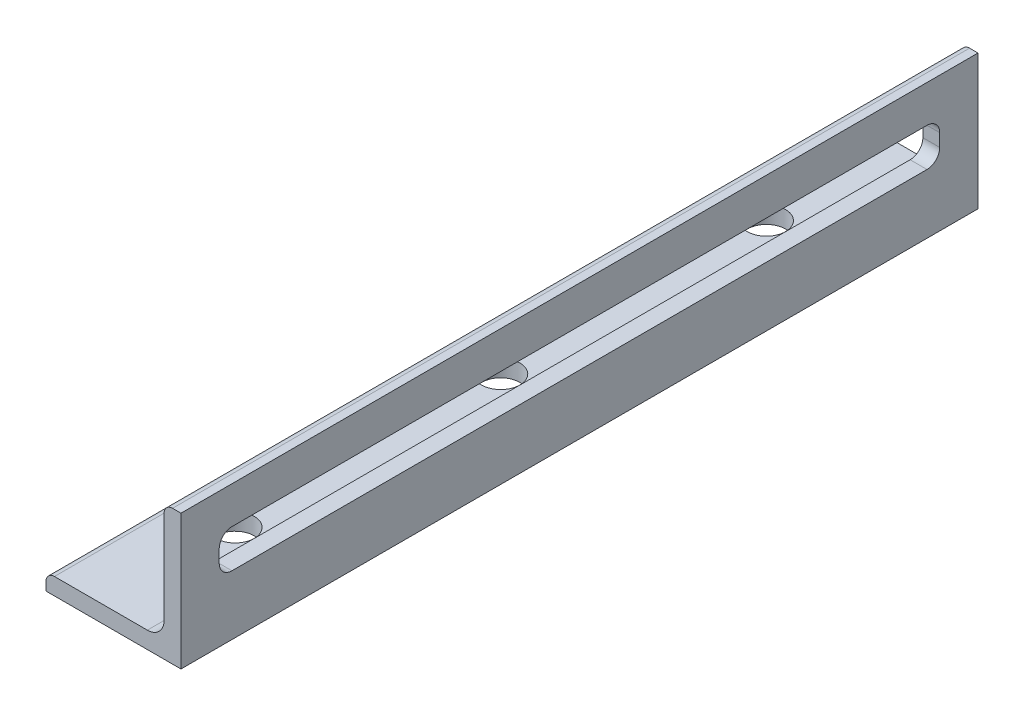
ISO-10303-21;
HEADER;
FILE_DESCRIPTION(('STEP AP214'),'2;1');
FILE_NAME('part.step','',(''),(''),'','','');
FILE_SCHEMA(('AUTOMOTIVE_DESIGN { 1 0 10303 214 1 1 1 1 }'));
ENDSEC;
DATA;
#1=APPLICATION_CONTEXT('core data for automotive mechanical design processes');
#2=APPLICATION_PROTOCOL_DEFINITION('international standard','automotive_design',2000,#1);
#3=PRODUCT_CONTEXT('',#1,'mechanical');
#4=PRODUCT('Part','Part','',(#3));
#5=PRODUCT_RELATED_PRODUCT_CATEGORY('part','',(#4));
#6=PRODUCT_DEFINITION_FORMATION('','',#4);
#7=PRODUCT_DEFINITION_CONTEXT('part definition',#1,'design');
#8=PRODUCT_DEFINITION('design','',#6,#7);
#9=PRODUCT_DEFINITION_SHAPE('','',#8);
#10=(LENGTH_UNIT() NAMED_UNIT(*) SI_UNIT(.MILLI.,.METRE.));
#11=(NAMED_UNIT(*) PLANE_ANGLE_UNIT() SI_UNIT($,.RADIAN.));
#12=(NAMED_UNIT(*) SI_UNIT($,.STERADIAN.) SOLID_ANGLE_UNIT());
#13=UNCERTAINTY_MEASURE_WITH_UNIT(LENGTH_MEASURE(1.E-05),#10,'distance_accuracy_value','');
#14=(GEOMETRIC_REPRESENTATION_CONTEXT(3) GLOBAL_UNCERTAINTY_ASSIGNED_CONTEXT((#13)) GLOBAL_UNIT_ASSIGNED_CONTEXT((#10,
#11,#12)) REPRESENTATION_CONTEXT('',''));
#15=CARTESIAN_POINT('',(0.,0.,0.));
#16=DIRECTION('',(0.,0.,1.));
#17=DIRECTION('',(1.,0.,0.));
#18=AXIS2_PLACEMENT_3D('',#15,#16,#17);
#19=CARTESIAN_POINT('',(-6.35,-5.55625000000001,37.5));
#20=DIRECTION('',(1.,0.,0.));
#21=DIRECTION('',(0.,0.,-1.));
#22=AXIS2_PLACEMENT_3D('',#19,#20,#21);
#23=PLANE('',#22);
#24=DIRECTION('',(0.,-1.,0.));
#25=VECTOR('',#24,1.);
#26=CARTESIAN_POINT('',(-6.35,-5.55625000000001,-37.5));
#27=LINE('',#26,#25);
#28=CARTESIAN_POINT('',(-6.35,-5.55625000000001,-37.5));
#29=VERTEX_POINT('',#28);
#30=CARTESIAN_POINT('',(-6.35,-6.35,-37.5));
#31=VERTEX_POINT('',#30);
#32=EDGE_CURVE('E279',#29,#31,#27,.T.);
#33=ORIENTED_EDGE('',*,*,#32,.T.);
#34=DIRECTION('',(0.,0.,-1.));
#35=VECTOR('',#34,1.);
#36=CARTESIAN_POINT('',(-6.35,-6.35,37.5));
#37=LINE('',#36,#35);
#38=CARTESIAN_POINT('',(-6.35,-6.35,37.5));
#39=VERTEX_POINT('',#38);
#40=EDGE_CURVE('E11',#39,#31,#37,.T.);
#41=ORIENTED_EDGE('',*,*,#40,.F.);
#42=DIRECTION('',(0.,-1.,0.));
#43=VECTOR('',#42,1.);
#44=CARTESIAN_POINT('',(-6.35,-5.55625000000001,37.5));
#45=LINE('',#44,#43);
#46=CARTESIAN_POINT('',(-6.35,-5.55625000000001,37.5));
#47=VERTEX_POINT('',#46);
#48=EDGE_CURVE('E283',#47,#39,#45,.T.);
#49=ORIENTED_EDGE('',*,*,#48,.F.);
#50=DIRECTION('',(0.,0.,-1.));
#51=VECTOR('',#50,1.);
#52=CARTESIAN_POINT('',(-6.35,-5.55625000000001,37.5));
#53=LINE('',#52,#51);
#54=EDGE_CURVE('E312',#47,#29,#53,.T.);
#55=ORIENTED_EDGE('',*,*,#54,.T.);
#56=EDGE_LOOP('',(#33,#41,#49,#55));
#57=FACE_BOUND('',#56,.T.);
#58=ADVANCED_FACE('F47',(#57),#23,.F.);
#59=CARTESIAN_POINT('',(-6.35,-6.35,37.5));
#60=DIRECTION('',(0.,1.,0.));
#61=DIRECTION('',(-1.,0.,0.));
#62=AXIS2_PLACEMENT_3D('',#59,#60,#61);
#63=PLANE('',#62);
#64=CARTESIAN_POINT('',(-1.06229999999997,-6.35,25.));
#65=DIRECTION('',(0.,1.,0.));
#66=DIRECTION('',(-1.,0.,0.));
#67=AXIS2_PLACEMENT_3D('',#64,#65,#66);
#68=CIRCLE('',#67,1.8);
#69=CARTESIAN_POINT('',(-2.86229999999997,-6.35,25.));
#70=VERTEX_POINT('',#69);
#71=EDGE_CURVE('E241',#70,#70,#68,.T.);
#72=ORIENTED_EDGE('',*,*,#71,.T.);
#73=EDGE_LOOP('',(#72));
#74=FACE_BOUND('',#73,.T.);
#75=CARTESIAN_POINT('',(-1.06229999999998,-6.35,-25.));
#76=DIRECTION('',(0.,1.,0.));
#77=DIRECTION('',(-1.,0.,0.));
#78=AXIS2_PLACEMENT_3D('',#75,#76,#77);
#79=CIRCLE('',#78,1.8);
#80=CARTESIAN_POINT('',(-2.86229999999998,-6.35,-25.));
#81=VERTEX_POINT('',#80);
#82=EDGE_CURVE('E264',#81,#81,#79,.T.);
#83=ORIENTED_EDGE('',*,*,#82,.T.);
#84=EDGE_LOOP('',(#83));
#85=FACE_BOUND('',#84,.T.);
#86=CARTESIAN_POINT('',(-1.06229999999997,-6.35,0.));
#87=DIRECTION('',(0.,1.,0.));
#88=DIRECTION('',(-1.,0.,0.));
#89=AXIS2_PLACEMENT_3D('',#86,#87,#88);
#90=CIRCLE('',#89,1.8);
#91=CARTESIAN_POINT('',(-2.86229999999997,-6.35,0.));
#92=VERTEX_POINT('',#91);
#93=EDGE_CURVE('E275',#92,#92,#90,.T.);
#94=ORIENTED_EDGE('',*,*,#93,.T.);
#95=EDGE_LOOP('',(#94));
#96=FACE_BOUND('',#95,.T.);
#97=DIRECTION('',(1.,0.,0.));
#98=VECTOR('',#97,1.);
#99=CARTESIAN_POINT('',(-6.35,-6.35,-37.5));
#100=LINE('',#99,#98);
#101=CARTESIAN_POINT('',(6.35,-6.35,-37.5));
#102=VERTEX_POINT('',#101);
#103=EDGE_CURVE('E316',#31,#102,#100,.T.);
#104=ORIENTED_EDGE('',*,*,#103,.T.);
#105=DIRECTION('',(0.,0.,-1.));
#106=VECTOR('',#105,1.);
#107=CARTESIAN_POINT('',(6.35,-6.35,37.5));
#108=LINE('',#107,#106);
#109=CARTESIAN_POINT('',(6.35,-6.35,37.5));
#110=VERTEX_POINT('',#109);
#111=EDGE_CURVE('E55',#110,#102,#108,.T.);
#112=ORIENTED_EDGE('',*,*,#111,.F.);
#113=DIRECTION('',(1.,0.,0.));
#114=VECTOR('',#113,1.);
#115=CARTESIAN_POINT('',(-6.35,-6.35,37.5));
#116=LINE('',#115,#114);
#117=EDGE_CURVE('E287',#39,#110,#116,.T.);
#118=ORIENTED_EDGE('',*,*,#117,.F.);
#119=ORIENTED_EDGE('',*,*,#40,.T.);
#120=EDGE_LOOP('',(#104,#112,#118,#119));
#121=FACE_BOUND('',#120,.T.);
#122=ADVANCED_FACE('F392',(#74,#85,#96,#121),#63,.F.);
#123=CARTESIAN_POINT('',(6.35,-6.35,37.5));
#124=DIRECTION('',(-1.,0.,0.));
#125=DIRECTION('',(0.,-1.,0.));
#126=AXIS2_PLACEMENT_3D('',#123,#124,#125);
#127=PLANE('',#126);
#128=DIRECTION('',(0.,0.,1.));
#129=VECTOR('',#128,1.);
#130=CARTESIAN_POINT('',(6.35,-0.743749999999987,-32.7));
#131=LINE('',#130,#129);
#132=CARTESIAN_POINT('',(6.35,-0.743749999999987,-32.7));
#133=VERTEX_POINT('',#132);
#134=CARTESIAN_POINT('',(6.35,-0.743749999999987,32.7));
#135=VERTEX_POINT('',#134);
#136=EDGE_CURVE('E175',#133,#135,#131,.T.);
#137=ORIENTED_EDGE('',*,*,#136,.T.);
#138=CARTESIAN_POINT('',(6.35,0.456250000000013,32.7));
#139=DIRECTION('',(-1.,0.,0.));
#140=DIRECTION('',(0.,1.,0.));
#141=AXIS2_PLACEMENT_3D('',#138,#139,#140);
#142=CIRCLE('',#141,1.19999999999999);
#143=CARTESIAN_POINT('',(6.35,0.456250000000013,33.9));
#144=VERTEX_POINT('',#143);
#145=EDGE_CURVE('E168',#135,#144,#142,.T.);
#146=ORIENTED_EDGE('',*,*,#145,.T.);
#147=DIRECTION('',(0.,1.,0.));
#148=VECTOR('',#147,1.);
#149=CARTESIAN_POINT('',(6.35,1.65625000000001,33.9));
#150=LINE('',#149,#148);
#151=CARTESIAN_POINT('',(6.35,1.65625000000001,33.9));
#152=VERTEX_POINT('',#151);
#153=EDGE_CURVE('E178',#144,#152,#150,.T.);
#154=ORIENTED_EDGE('',*,*,#153,.T.);
#155=CARTESIAN_POINT('',(6.35,1.65625000000001,32.7));
#156=DIRECTION('',(-1.,0.,0.));
#157=DIRECTION('',(0.,1.,0.));
#158=AXIS2_PLACEMENT_3D('',#155,#156,#157);
#159=CIRCLE('',#158,1.2);
#160=CARTESIAN_POINT('',(6.35,2.85625000000001,32.7));
#161=VERTEX_POINT('',#160);
#162=EDGE_CURVE('E62',#152,#161,#159,.T.);
#163=ORIENTED_EDGE('',*,*,#162,.T.);
#164=DIRECTION('',(0.,0.,-1.));
#165=VECTOR('',#164,1.);
#166=CARTESIAN_POINT('',(6.35,2.85625000000001,-32.7));
#167=LINE('',#166,#165);
#168=CARTESIAN_POINT('',(6.35,2.85625000000001,-32.7));
#169=VERTEX_POINT('',#168);
#170=EDGE_CURVE('E197',#161,#169,#167,.T.);
#171=ORIENTED_EDGE('',*,*,#170,.T.);
#172=CARTESIAN_POINT('',(6.35,1.65625000000001,-32.7));
#173=DIRECTION('',(-1.,0.,0.));
#174=DIRECTION('',(0.,-1.,0.));
#175=AXIS2_PLACEMENT_3D('',#172,#173,#174);
#176=CIRCLE('',#175,1.2);
#177=CARTESIAN_POINT('',(6.35,1.65625000000001,-33.9));
#178=VERTEX_POINT('',#177);
#179=EDGE_CURVE('E201',#169,#178,#176,.T.);
#180=ORIENTED_EDGE('',*,*,#179,.T.);
#181=DIRECTION('',(0.,-1.,0.));
#182=VECTOR('',#181,1.);
#183=CARTESIAN_POINT('',(6.35,1.65625000000001,-33.9));
#184=LINE('',#183,#182);
#185=CARTESIAN_POINT('',(6.35,0.456250000000013,-33.9));
#186=VERTEX_POINT('',#185);
#187=EDGE_CURVE('E205',#178,#186,#184,.T.);
#188=ORIENTED_EDGE('',*,*,#187,.T.);
#189=CARTESIAN_POINT('',(6.35,0.456250000000013,-32.7));
#190=DIRECTION('',(-1.,0.,0.));
#191=DIRECTION('',(0.,1.,0.));
#192=AXIS2_PLACEMENT_3D('',#189,#190,#191);
#193=CIRCLE('',#192,1.2);
#194=EDGE_CURVE('E209',#186,#133,#193,.T.);
#195=ORIENTED_EDGE('',*,*,#194,.T.);
#196=EDGE_LOOP('',(#137,#146,#154,#163,#171,#180,#188,#195));
#197=FACE_BOUND('',#196,.T.);
#198=DIRECTION('',(0.,1.,0.));
#199=VECTOR('',#198,1.);
#200=CARTESIAN_POINT('',(6.35,-6.35,-37.5));
#201=LINE('',#200,#199);
#202=CARTESIAN_POINT('',(6.35,6.35,-37.5));
#203=VERTEX_POINT('',#202);
#204=EDGE_CURVE('E319',#102,#203,#201,.T.);
#205=ORIENTED_EDGE('',*,*,#204,.T.);
#206=DIRECTION('',(0.,0.,-1.));
#207=VECTOR('',#206,1.);
#208=CARTESIAN_POINT('',(6.35,6.35,37.5));
#209=LINE('',#208,#207);
#210=CARTESIAN_POINT('',(6.35,6.35,37.5));
#211=VERTEX_POINT('',#210);
#212=EDGE_CURVE('E362',#211,#203,#209,.T.);
#213=ORIENTED_EDGE('',*,*,#212,.F.);
#214=DIRECTION('',(0.,1.,0.));
#215=VECTOR('',#214,1.);
#216=CARTESIAN_POINT('',(6.35,-6.35,37.5));
#217=LINE('',#216,#215);
#218=EDGE_CURVE('E291',#110,#211,#217,.T.);
#219=ORIENTED_EDGE('',*,*,#218,.F.);
#220=ORIENTED_EDGE('',*,*,#111,.T.);
#221=EDGE_LOOP('',(#205,#213,#219,#220));
#222=FACE_BOUND('',#221,.T.);
#223=ADVANCED_FACE('F183',(#197,#222),#127,.F.);
#224=CARTESIAN_POINT('',(5.55625000000001,6.35,37.5));
#225=DIRECTION('',(0.,-1.,0.));
#226=DIRECTION('',(1.,0.,0.));
#227=AXIS2_PLACEMENT_3D('',#224,#225,#226);
#228=PLANE('',#227);
#229=DIRECTION('',(-1.,0.,0.));
#230=VECTOR('',#229,1.);
#231=CARTESIAN_POINT('',(5.55625000000001,6.35,-37.5));
#232=LINE('',#231,#230);
#233=CARTESIAN_POINT('',(5.55625000000001,6.35,-37.5));
#234=VERTEX_POINT('',#233);
#235=EDGE_CURVE('E322',#203,#234,#232,.T.);
#236=ORIENTED_EDGE('',*,*,#235,.T.);
#237=DIRECTION('',(0.,0.,-1.));
#238=VECTOR('',#237,1.);
#239=CARTESIAN_POINT('',(5.55625000000001,6.35,37.5));
#240=LINE('',#239,#238);
#241=CARTESIAN_POINT('',(5.55625000000001,6.35,37.5));
#242=VERTEX_POINT('',#241);
#243=EDGE_CURVE('E358',#242,#234,#240,.T.);
#244=ORIENTED_EDGE('',*,*,#243,.F.);
#245=DIRECTION('',(-1.,0.,0.));
#246=VECTOR('',#245,1.);
#247=CARTESIAN_POINT('',(5.55625000000001,6.35,37.5));
#248=LINE('',#247,#246);
#249=EDGE_CURVE('E294',#211,#242,#248,.T.);
#250=ORIENTED_EDGE('',*,*,#249,.F.);
#251=ORIENTED_EDGE('',*,*,#212,.T.);
#252=EDGE_LOOP('',(#236,#244,#250,#251));
#253=FACE_BOUND('',#252,.T.);
#254=ADVANCED_FACE('F380',(#253),#228,.F.);
#255=CARTESIAN_POINT('',(5.55625000000001,5.55625000000001,37.5));
#256=DIRECTION('',(0.,0.,-1.));
#257=DIRECTION('',(-1.,0.,0.));
#258=AXIS2_PLACEMENT_3D('',#255,#256,#257);
#259=CYLINDRICAL_SURFACE('',#258,0.793749999999986);
#260=CARTESIAN_POINT('',(5.55625000000001,5.55625000000001,-37.5));
#261=DIRECTION('',(0.,0.,1.));
#262=DIRECTION('',(-1.,0.,0.));
#263=AXIS2_PLACEMENT_3D('',#260,#261,#262);
#264=CIRCLE('',#263,0.793749999999986);
#265=CARTESIAN_POINT('',(4.76250000000003,5.55625000000001,-37.5));
#266=VERTEX_POINT('',#265);
#267=EDGE_CURVE('E325',#234,#266,#264,.T.);
#268=ORIENTED_EDGE('',*,*,#267,.T.);
#269=DIRECTION('',(0.,0.,-1.));
#270=VECTOR('',#269,1.);
#271=CARTESIAN_POINT('',(4.76250000000003,5.55625000000001,37.5));
#272=LINE('',#271,#270);
#273=CARTESIAN_POINT('',(4.76250000000003,5.55625000000001,37.5));
#274=VERTEX_POINT('',#273);
#275=EDGE_CURVE('E354',#274,#266,#272,.T.);
#276=ORIENTED_EDGE('',*,*,#275,.F.);
#277=CARTESIAN_POINT('',(5.55625000000001,5.55625000000001,37.5));
#278=DIRECTION('',(0.,0.,1.));
#279=DIRECTION('',(-1.,0.,0.));
#280=AXIS2_PLACEMENT_3D('',#277,#278,#279);
#281=CIRCLE('',#280,0.793749999999986);
#282=EDGE_CURVE('E297',#242,#274,#281,.T.);
#283=ORIENTED_EDGE('',*,*,#282,.F.);
#284=ORIENTED_EDGE('',*,*,#243,.T.);
#285=EDGE_LOOP('',(#268,#276,#283,#284));
#286=FACE_BOUND('',#285,.T.);
#287=ADVANCED_FACE('F384',(#286),#259,.T.);
#288=CARTESIAN_POINT('',(4.76250000000003,5.55625000000001,37.5));
#289=DIRECTION('',(1.,0.,0.));
#290=DIRECTION('',(0.,1.,0.));
#291=AXIS2_PLACEMENT_3D('',#288,#289,#290);
#292=PLANE('',#291);
#293=DIRECTION('',(0.,1.,0.));
#294=VECTOR('',#293,1.);
#295=CARTESIAN_POINT('',(4.76250000000003,1.65625000000001,33.9));
#296=LINE('',#295,#294);
#297=CARTESIAN_POINT('',(4.76250000000003,0.456250000000012,33.9));
#298=VERTEX_POINT('',#297);
#299=CARTESIAN_POINT('',(4.76250000000003,1.65625000000001,33.9));
#300=VERTEX_POINT('',#299);
#301=EDGE_CURVE('E216',#298,#300,#296,.T.);
#302=ORIENTED_EDGE('',*,*,#301,.F.);
#303=CARTESIAN_POINT('',(4.76250000000003,0.456250000000013,32.7));
#304=DIRECTION('',(-1.,0.,0.));
#305=DIRECTION('',(0.,1.,0.));
#306=AXIS2_PLACEMENT_3D('',#303,#304,#305);
#307=CIRCLE('',#306,1.19999999999999);
#308=CARTESIAN_POINT('',(4.76250000000003,-0.743749999999987,32.7));
#309=VERTEX_POINT('',#308);
#310=EDGE_CURVE('E70',#309,#298,#307,.T.);
#311=ORIENTED_EDGE('',*,*,#310,.F.);
#312=DIRECTION('',(0.,0.,1.));
#313=VECTOR('',#312,1.);
#314=CARTESIAN_POINT('',(4.76250000000003,-0.743749999999987,-32.7));
#315=LINE('',#314,#313);
#316=CARTESIAN_POINT('',(4.76250000000003,-0.743749999999987,-32.7));
#317=VERTEX_POINT('',#316);
#318=EDGE_CURVE('E188',#317,#309,#315,.T.);
#319=ORIENTED_EDGE('',*,*,#318,.F.);
#320=CARTESIAN_POINT('',(4.76250000000003,0.456250000000013,-32.7));
#321=DIRECTION('',(-1.,0.,0.));
#322=DIRECTION('',(0.,1.,0.));
#323=AXIS2_PLACEMENT_3D('',#320,#321,#322);
#324=CIRCLE('',#323,1.2);
#325=CARTESIAN_POINT('',(4.76250000000003,0.456250000000013,-33.9));
#326=VERTEX_POINT('',#325);
#327=EDGE_CURVE('E192',#326,#317,#324,.T.);
#328=ORIENTED_EDGE('',*,*,#327,.F.);
#329=DIRECTION('',(0.,-1.,0.));
#330=VECTOR('',#329,1.);
#331=CARTESIAN_POINT('',(4.76250000000003,1.65625000000001,-33.9));
#332=LINE('',#331,#330);
#333=CARTESIAN_POINT('',(4.76250000000003,1.65625000000001,-33.9));
#334=VERTEX_POINT('',#333);
#335=EDGE_CURVE('E231',#334,#326,#332,.T.);
#336=ORIENTED_EDGE('',*,*,#335,.F.);
#337=CARTESIAN_POINT('',(4.76250000000003,1.65625000000001,-32.7));
#338=DIRECTION('',(-1.,0.,0.));
#339=DIRECTION('',(0.,-1.,0.));
#340=AXIS2_PLACEMENT_3D('',#337,#338,#339);
#341=CIRCLE('',#340,1.2);
#342=CARTESIAN_POINT('',(4.76250000000003,2.85625000000001,-32.7));
#343=VERTEX_POINT('',#342);
#344=EDGE_CURVE('E227',#343,#334,#341,.T.);
#345=ORIENTED_EDGE('',*,*,#344,.F.);
#346=DIRECTION('',(0.,0.,-1.));
#347=VECTOR('',#346,1.);
#348=CARTESIAN_POINT('',(4.76250000000003,2.85625000000001,-32.7));
#349=LINE('',#348,#347);
#350=CARTESIAN_POINT('',(4.76250000000003,2.85625000000001,32.7));
#351=VERTEX_POINT('',#350);
#352=EDGE_CURVE('E223',#351,#343,#349,.T.);
#353=ORIENTED_EDGE('',*,*,#352,.F.);
#354=CARTESIAN_POINT('',(4.76250000000003,1.65625000000001,32.7));
#355=DIRECTION('',(-1.,0.,0.));
#356=DIRECTION('',(0.,1.,0.));
#357=AXIS2_PLACEMENT_3D('',#354,#355,#356);
#358=CIRCLE('',#357,1.2);
#359=EDGE_CURVE('E219',#300,#351,#358,.T.);
#360=ORIENTED_EDGE('',*,*,#359,.F.);
#361=EDGE_LOOP('',(#302,#311,#319,#328,#336,#345,#353,#360));
#362=FACE_BOUND('',#361,.T.);
#363=DIRECTION('',(0.,-1.,0.));
#364=VECTOR('',#363,1.);
#365=CARTESIAN_POINT('',(4.76250000000003,5.55625000000001,-37.5));
#366=LINE('',#365,#364);
#367=CARTESIAN_POINT('',(4.76250000000003,-3.18770000000002,-37.5));
#368=VERTEX_POINT('',#367);
#369=EDGE_CURVE('E328',#266,#368,#366,.T.);
#370=ORIENTED_EDGE('',*,*,#369,.T.);
#371=DIRECTION('',(0.,0.,-1.));
#372=VECTOR('',#371,1.);
#373=CARTESIAN_POINT('',(4.76250000000003,-3.18770000000002,37.5));
#374=LINE('',#373,#372);
#375=CARTESIAN_POINT('',(4.76250000000003,-3.18770000000002,37.5));
#376=VERTEX_POINT('',#375);
#377=EDGE_CURVE('E350',#376,#368,#374,.T.);
#378=ORIENTED_EDGE('',*,*,#377,.F.);
#379=DIRECTION('',(0.,-1.,0.));
#380=VECTOR('',#379,1.);
#381=CARTESIAN_POINT('',(4.76250000000003,5.55625000000001,37.5));
#382=LINE('',#381,#380);
#383=EDGE_CURVE('E300',#274,#376,#382,.T.);
#384=ORIENTED_EDGE('',*,*,#383,.F.);
#385=ORIENTED_EDGE('',*,*,#275,.T.);
#386=EDGE_LOOP('',(#370,#378,#384,#385));
#387=FACE_BOUND('',#386,.T.);
#388=ADVANCED_FACE('F410',(#362,#387),#292,.F.);
#389=CARTESIAN_POINT('',(3.18770000000003,-3.18770000000002,37.5));
#390=DIRECTION('',(0.,0.,-1.));
#391=DIRECTION('',(-1.,0.,0.));
#392=AXIS2_PLACEMENT_3D('',#389,#390,#391);
#393=CYLINDRICAL_SURFACE('',#392,1.5748);
#394=CARTESIAN_POINT('',(3.18770000000003,-3.18770000000002,-37.5));
#395=DIRECTION('',(0.,0.,-1.));
#396=DIRECTION('',(-1.,0.,0.));
#397=AXIS2_PLACEMENT_3D('',#394,#395,#396);
#398=CIRCLE('',#397,1.5748);
#399=CARTESIAN_POINT('',(3.18770000000003,-4.76250000000002,-37.5));
#400=VERTEX_POINT('',#399);
#401=EDGE_CURVE('E331',#368,#400,#398,.T.);
#402=ORIENTED_EDGE('',*,*,#401,.T.);
#403=DIRECTION('',(0.,0.,-1.));
#404=VECTOR('',#403,1.);
#405=CARTESIAN_POINT('',(3.18770000000003,-4.76250000000002,37.5));
#406=LINE('',#405,#404);
#407=CARTESIAN_POINT('',(3.18770000000003,-4.76250000000002,37.5));
#408=VERTEX_POINT('',#407);
#409=EDGE_CURVE('E346',#408,#400,#406,.T.);
#410=ORIENTED_EDGE('',*,*,#409,.F.);
#411=CARTESIAN_POINT('',(3.18770000000003,-3.18770000000002,37.5));
#412=DIRECTION('',(0.,0.,-1.));
#413=DIRECTION('',(-1.,0.,0.));
#414=AXIS2_PLACEMENT_3D('',#411,#412,#413);
#415=CIRCLE('',#414,1.5748);
#416=EDGE_CURVE('E303',#376,#408,#415,.T.);
#417=ORIENTED_EDGE('',*,*,#416,.F.);
#418=ORIENTED_EDGE('',*,*,#377,.T.);
#419=EDGE_LOOP('',(#402,#410,#417,#418));
#420=FACE_BOUND('',#419,.T.);
#421=ADVANCED_FACE('F408',(#420),#393,.F.);
#422=CARTESIAN_POINT('',(3.18770000000003,-4.76250000000002,37.5));
#423=DIRECTION('',(0.,-1.,0.));
#424=DIRECTION('',(1.,0.,0.));
#425=AXIS2_PLACEMENT_3D('',#422,#423,#424);
#426=PLANE('',#425);
#427=CARTESIAN_POINT('',(-1.06229999999997,-4.76250000000002,25.));
#428=DIRECTION('',(0.,1.,0.));
#429=DIRECTION('',(-1.,0.,0.));
#430=AXIS2_PLACEMENT_3D('',#427,#428,#429);
#431=CIRCLE('',#430,1.8);
#432=CARTESIAN_POINT('',(-2.86229999999997,-4.76250000000002,25.));
#433=VERTEX_POINT('',#432);
#434=EDGE_CURVE('E268',#433,#433,#431,.T.);
#435=ORIENTED_EDGE('',*,*,#434,.F.);
#436=EDGE_LOOP('',(#435));
#437=FACE_BOUND('',#436,.T.);
#438=CARTESIAN_POINT('',(-1.06229999999998,-4.76250000000002,-25.));
#439=DIRECTION('',(0.,1.,0.));
#440=DIRECTION('',(-1.,0.,0.));
#441=AXIS2_PLACEMENT_3D('',#438,#439,#440);
#442=CIRCLE('',#441,1.8);
#443=CARTESIAN_POINT('',(-2.86229999999998,-4.76250000000002,-25.));
#444=VERTEX_POINT('',#443);
#445=EDGE_CURVE('E259',#444,#444,#442,.T.);
#446=ORIENTED_EDGE('',*,*,#445,.F.);
#447=EDGE_LOOP('',(#446));
#448=FACE_BOUND('',#447,.T.);
#449=CARTESIAN_POINT('',(-1.06229999999997,-4.76250000000002,0.));
#450=DIRECTION('',(0.,1.,0.));
#451=DIRECTION('',(-1.,0.,0.));
#452=AXIS2_PLACEMENT_3D('',#449,#450,#451);
#453=CIRCLE('',#452,1.8);
#454=CARTESIAN_POINT('',(-2.86229999999997,-4.76250000000002,0.));
#455=VERTEX_POINT('',#454);
#456=EDGE_CURVE('E263',#455,#455,#453,.T.);
#457=ORIENTED_EDGE('',*,*,#456,.F.);
#458=EDGE_LOOP('',(#457));
#459=FACE_BOUND('',#458,.T.);
#460=DIRECTION('',(-1.,0.,0.));
#461=VECTOR('',#460,1.);
#462=CARTESIAN_POINT('',(3.18770000000003,-4.76250000000002,-37.5));
#463=LINE('',#462,#461);
#464=CARTESIAN_POINT('',(-5.55625000000001,-4.76250000000003,-37.5));
#465=VERTEX_POINT('',#464);
#466=EDGE_CURVE('E334',#400,#465,#463,.T.);
#467=ORIENTED_EDGE('',*,*,#466,.T.);
#468=DIRECTION('',(0.,0.,-1.));
#469=VECTOR('',#468,1.);
#470=CARTESIAN_POINT('',(-5.55625000000001,-4.76250000000003,37.5));
#471=LINE('',#470,#469);
#472=CARTESIAN_POINT('',(-5.55625000000001,-4.76250000000003,37.5));
#473=VERTEX_POINT('',#472);
#474=EDGE_CURVE('E342',#473,#465,#471,.T.);
#475=ORIENTED_EDGE('',*,*,#474,.F.);
#476=DIRECTION('',(-1.,0.,0.));
#477=VECTOR('',#476,1.);
#478=CARTESIAN_POINT('',(3.18770000000003,-4.76250000000002,37.5));
#479=LINE('',#478,#477);
#480=EDGE_CURVE('E306',#408,#473,#479,.T.);
#481=ORIENTED_EDGE('',*,*,#480,.F.);
#482=ORIENTED_EDGE('',*,*,#409,.T.);
#483=EDGE_LOOP('',(#467,#475,#481,#482));
#484=FACE_BOUND('',#483,.T.);
#485=ADVANCED_FACE('F404',(#437,#448,#459,#484),#426,.F.);
#486=CARTESIAN_POINT('',(-5.55625000000001,-5.55625000000001,37.5));
#487=DIRECTION('',(0.,0.,-1.));
#488=DIRECTION('',(-1.,0.,0.));
#489=AXIS2_PLACEMENT_3D('',#486,#487,#488);
#490=CYLINDRICAL_SURFACE('',#489,0.793749999999987);
#491=CARTESIAN_POINT('',(-5.55625000000001,-5.55625000000001,-37.5));
#492=DIRECTION('',(0.,0.,1.));
#493=DIRECTION('',(-1.,0.,0.));
#494=AXIS2_PLACEMENT_3D('',#491,#492,#493);
#495=CIRCLE('',#494,0.793749999999987);
#496=EDGE_CURVE('E288',#465,#29,#495,.T.);
#497=ORIENTED_EDGE('',*,*,#496,.T.);
#498=ORIENTED_EDGE('',*,*,#54,.F.);
#499=CARTESIAN_POINT('',(-5.55625000000001,-5.55625000000001,37.5));
#500=DIRECTION('',(0.,0.,1.));
#501=DIRECTION('',(-1.,0.,0.));
#502=AXIS2_PLACEMENT_3D('',#499,#500,#501);
#503=CIRCLE('',#502,0.793749999999987);
#504=EDGE_CURVE('E309',#473,#47,#503,.T.);
#505=ORIENTED_EDGE('',*,*,#504,.F.);
#506=ORIENTED_EDGE('',*,*,#474,.T.);
#507=EDGE_LOOP('',(#497,#498,#505,#506));
#508=FACE_BOUND('',#507,.T.);
#509=ADVANCED_FACE('F399',(#508),#490,.T.);
#510=CARTESIAN_POINT('',(5.55625000000001,5.55625000000001,37.5));
#511=DIRECTION('',(0.,0.,-1.));
#512=DIRECTION('',(-1.,0.,0.));
#513=AXIS2_PLACEMENT_3D('',#510,#511,#512);
#514=PLANE('',#513);
#515=ORIENTED_EDGE('',*,*,#48,.T.);
#516=ORIENTED_EDGE('',*,*,#117,.T.);
#517=ORIENTED_EDGE('',*,*,#218,.T.);
#518=ORIENTED_EDGE('',*,*,#249,.T.);
#519=ORIENTED_EDGE('',*,*,#282,.T.);
#520=ORIENTED_EDGE('',*,*,#383,.T.);
#521=ORIENTED_EDGE('',*,*,#416,.T.);
#522=ORIENTED_EDGE('',*,*,#480,.T.);
#523=ORIENTED_EDGE('',*,*,#504,.T.);
#524=EDGE_LOOP('',(#515,#516,#517,#518,#519,#520,#521,#522,#523));
#525=FACE_BOUND('',#524,.T.);
#526=ADVANCED_FACE('F388',(#525),#514,.F.);
#527=CARTESIAN_POINT('',(5.55625000000001,5.55625000000001,-37.5));
#528=DIRECTION('',(0.,0.,-1.));
#529=DIRECTION('',(-1.,0.,0.));
#530=AXIS2_PLACEMENT_3D('',#527,#528,#529);
#531=PLANE('',#530);
#532=ORIENTED_EDGE('',*,*,#32,.F.);
#533=ORIENTED_EDGE('',*,*,#496,.F.);
#534=ORIENTED_EDGE('',*,*,#466,.F.);
#535=ORIENTED_EDGE('',*,*,#401,.F.);
#536=ORIENTED_EDGE('',*,*,#369,.F.);
#537=ORIENTED_EDGE('',*,*,#267,.F.);
#538=ORIENTED_EDGE('',*,*,#235,.F.);
#539=ORIENTED_EDGE('',*,*,#204,.F.);
#540=ORIENTED_EDGE('',*,*,#103,.F.);
#541=EDGE_LOOP('',(#532,#533,#534,#535,#536,#537,#538,#539,#540));
#542=FACE_BOUND('',#541,.T.);
#543=ADVANCED_FACE('F375',(#542),#531,.T.);
#544=CARTESIAN_POINT('',(-1.06229999999997,-6.35,0.));
#545=DIRECTION('',(0.,1.,0.));
#546=DIRECTION('',(-1.,0.,0.));
#547=AXIS2_PLACEMENT_3D('',#544,#545,#546);
#548=CYLINDRICAL_SURFACE('',#547,1.8);
#549=CARTESIAN_POINT('',(-2.86229999999997,-6.35,0.));
#550=CARTESIAN_POINT('',(-2.86229999999997,-6.33346354166667,0.));
#551=CARTESIAN_POINT('',(-2.86229999999997,-6.31692708333333,0.));
#552=CARTESIAN_POINT('',(-2.86229999999997,-6.28385416666667,0.));
#553=CARTESIAN_POINT('',(-2.86229999999997,-6.26731770833334,0.));
#554=CARTESIAN_POINT('',(-2.86229999999997,-6.23424479166667,0.));
#555=CARTESIAN_POINT('',(-2.86229999999997,-6.21770833333334,0.));
#556=CARTESIAN_POINT('',(-2.86229999999997,-6.18463541666667,0.));
#557=CARTESIAN_POINT('',(-2.86229999999997,-6.16809895833334,0.));
#558=CARTESIAN_POINT('',(-2.86229999999997,-6.13502604166667,0.));
#559=CARTESIAN_POINT('',(-2.86229999999997,-6.11848958333334,0.));
#560=CARTESIAN_POINT('',(-2.86229999999997,-6.08541666666667,0.));
#561=CARTESIAN_POINT('',(-2.86229999999997,-6.06888020833334,0.));
#562=CARTESIAN_POINT('',(-2.86229999999997,-6.03580729166667,0.));
#563=CARTESIAN_POINT('',(-2.86229999999997,-6.01927083333334,0.));
#564=CARTESIAN_POINT('',(-2.86229999999997,-5.98619791666667,0.));
#565=CARTESIAN_POINT('',(-2.86229999999997,-5.96966145833334,0.));
#566=CARTESIAN_POINT('',(-2.86229999999997,-5.93658854166667,0.));
#567=CARTESIAN_POINT('',(-2.86229999999997,-5.92005208333334,0.));
#568=CARTESIAN_POINT('',(-2.86229999999997,-5.88697916666668,0.));
#569=CARTESIAN_POINT('',(-2.86229999999997,-5.87044270833334,0.));
#570=CARTESIAN_POINT('',(-2.86229999999997,-5.83736979166668,0.));
#571=CARTESIAN_POINT('',(-2.86229999999997,-5.82083333333334,0.));
#572=CARTESIAN_POINT('',(-2.86229999999997,-5.78776041666668,0.));
#573=CARTESIAN_POINT('',(-2.86229999999997,-5.77122395833334,0.));
#574=CARTESIAN_POINT('',(-2.86229999999997,-5.73815104166668,0.));
#575=CARTESIAN_POINT('',(-2.86229999999997,-5.72161458333334,0.));
#576=CARTESIAN_POINT('',(-2.86229999999997,-5.68854166666668,0.));
#577=CARTESIAN_POINT('',(-2.86229999999997,-5.67200520833334,0.));
#578=CARTESIAN_POINT('',(-2.86229999999997,-5.63893229166668,0.));
#579=CARTESIAN_POINT('',(-2.86229999999997,-5.62239583333335,0.));
#580=CARTESIAN_POINT('',(-2.86229999999997,-5.58932291666668,0.));
#581=CARTESIAN_POINT('',(-2.86229999999997,-5.57278645833335,0.));
#582=CARTESIAN_POINT('',(-2.86229999999997,-5.53971354166668,0.));
#583=CARTESIAN_POINT('',(-2.86229999999997,-5.52317708333335,0.));
#584=CARTESIAN_POINT('',(-2.86229999999997,-5.49010416666668,0.));
#585=CARTESIAN_POINT('',(-2.86229999999997,-5.47356770833335,0.));
#586=CARTESIAN_POINT('',(-2.86229999999997,-5.44049479166668,0.));
#587=CARTESIAN_POINT('',(-2.86229999999997,-5.42395833333335,0.));
#588=CARTESIAN_POINT('',(-2.86229999999997,-5.39088541666668,0.));
#589=CARTESIAN_POINT('',(-2.86229999999997,-5.37434895833335,0.));
#590=CARTESIAN_POINT('',(-2.86229999999997,-5.34127604166668,0.));
#591=CARTESIAN_POINT('',(-2.86229999999997,-5.32473958333335,0.));
#592=CARTESIAN_POINT('',(-2.86229999999997,-5.29166666666668,0.));
#593=CARTESIAN_POINT('',(-2.86229999999997,-5.27513020833335,0.));
#594=CARTESIAN_POINT('',(-2.86229999999997,-5.24205729166668,0.));
#595=CARTESIAN_POINT('',(-2.86229999999997,-5.22552083333335,0.));
#596=CARTESIAN_POINT('',(-2.86229999999997,-5.19244791666668,0.));
#597=CARTESIAN_POINT('',(-2.86229999999997,-5.17591145833335,0.));
#598=CARTESIAN_POINT('',(-2.86229999999997,-5.14283854166669,0.));
#599=CARTESIAN_POINT('',(-2.86229999999997,-5.12630208333335,0.));
#600=CARTESIAN_POINT('',(-2.86229999999997,-5.09322916666669,0.));
#601=CARTESIAN_POINT('',(-2.86229999999997,-5.07669270833335,0.));
#602=CARTESIAN_POINT('',(-2.86229999999997,-5.04361979166669,0.));
#603=CARTESIAN_POINT('',(-2.86229999999997,-5.02708333333335,0.));
#604=CARTESIAN_POINT('',(-2.86229999999997,-4.99401041666669,0.));
#605=CARTESIAN_POINT('',(-2.86229999999997,-4.97747395833335,0.));
#606=CARTESIAN_POINT('',(-2.86229999999997,-4.94440104166669,0.));
#607=CARTESIAN_POINT('',(-2.86229999999997,-4.92786458333336,0.));
#608=CARTESIAN_POINT('',(-2.86229999999997,-4.89479166666669,0.));
#609=CARTESIAN_POINT('',(-2.86229999999997,-4.87825520833336,0.));
#610=CARTESIAN_POINT('',(-2.86229999999997,-4.84518229166669,0.));
#611=CARTESIAN_POINT('',(-2.86229999999997,-4.82864583333336,0.));
#612=CARTESIAN_POINT('',(-2.86229999999997,-4.79557291666669,0.));
#613=CARTESIAN_POINT('',(-2.86229999999997,-4.77903645833336,0.));
#614=CARTESIAN_POINT('',(-2.86229999999997,-4.76250000000002,0.));
#615=B_SPLINE_CURVE_WITH_KNOTS('',3,(#549,#550,#551,#552,#553,#554,#555,#556,#557,#558,#559,
#560,#561,#562,#563,#564,#565,#566,#567,#568,#569,#570,#571,#572,#573,#574,#575,#576,#577,#578,
#579,#580,#581,#582,#583,#584,#585,#586,#587,#588,#589,#590,#591,#592,#593,#594,#595,#596,#597,
#598,#599,#600,#601,#602,#603,#604,#605,#606,#607,#608,#609,#610,#611,#612,#613,#614),
.UNSPECIFIED.,.F.,.F.,(4,2,2,2,2,2,2,2,2,2,2,2,2,2,2,2,2,2,2,2,2,2,2,2,2,2,2,2,2,2,2,2,4),(0.,
0.0496093749999997,0.0992187499999986,0.148828124999998,0.198437499999997,0.248046874999997,
0.297656249999996,0.347265624999996,0.396874999999994,0.446484374999993,0.496093749999993,
0.545703124999992,0.595312499999992,0.644921874999991,0.69453124999999,0.744140624999989,
0.793749999999989,0.843359374999988,0.892968749999987,0.942578124999986,0.992187499999985,
1.04179687499999,1.09140624999998,1.14101562499998,1.19062499999998,1.24023437499998,
1.28984374999998,1.33945312499998,1.38906249999998,1.43867187499998,1.48828124999998,
1.53789062499998,1.58749999999998),.UNSPECIFIED.);
#616=EDGE_CURVE('BSEAM471',#92,#455,#615,.T.);
#617=ORIENTED_EDGE('',*,*,#93,.F.);
#618=ORIENTED_EDGE('',*,*,#456,.T.);
#619=ORIENTED_EDGE('',*,*,#616,.T.);
#620=ORIENTED_EDGE('',*,*,#616,.F.);
#621=EDGE_LOOP('',(#617,#619,#618,#620));
#622=FACE_BOUND('',#621,.T.);
#623=ADVANCED_FACE('F471',(#622),#548,.F.);
#624=CARTESIAN_POINT('',(-1.06229999999998,-6.35,-25.));
#625=DIRECTION('',(0.,1.,0.));
#626=DIRECTION('',(-1.,0.,0.));
#627=AXIS2_PLACEMENT_3D('',#624,#625,#626);
#628=CYLINDRICAL_SURFACE('',#627,1.8);
#629=CARTESIAN_POINT('',(-2.86229999999998,-6.35,-25.));
#630=CARTESIAN_POINT('',(-2.86229999999998,-6.33346354166667,-25.));
#631=CARTESIAN_POINT('',(-2.86229999999998,-6.31692708333333,-25.));
#632=CARTESIAN_POINT('',(-2.86229999999998,-6.28385416666667,-25.));
#633=CARTESIAN_POINT('',(-2.86229999999998,-6.26731770833334,-25.));
#634=CARTESIAN_POINT('',(-2.86229999999998,-6.23424479166667,-25.));
#635=CARTESIAN_POINT('',(-2.86229999999998,-6.21770833333334,-25.));
#636=CARTESIAN_POINT('',(-2.86229999999998,-6.18463541666667,-25.));
#637=CARTESIAN_POINT('',(-2.86229999999998,-6.16809895833334,-25.));
#638=CARTESIAN_POINT('',(-2.86229999999998,-6.13502604166667,-25.));
#639=CARTESIAN_POINT('',(-2.86229999999998,-6.11848958333334,-25.));
#640=CARTESIAN_POINT('',(-2.86229999999998,-6.08541666666667,-25.));
#641=CARTESIAN_POINT('',(-2.86229999999998,-6.06888020833334,-25.));
#642=CARTESIAN_POINT('',(-2.86229999999998,-6.03580729166667,-25.));
#643=CARTESIAN_POINT('',(-2.86229999999998,-6.01927083333334,-25.));
#644=CARTESIAN_POINT('',(-2.86229999999998,-5.98619791666667,-25.));
#645=CARTESIAN_POINT('',(-2.86229999999998,-5.96966145833334,-25.));
#646=CARTESIAN_POINT('',(-2.86229999999998,-5.93658854166667,-25.));
#647=CARTESIAN_POINT('',(-2.86229999999998,-5.92005208333334,-25.));
#648=CARTESIAN_POINT('',(-2.86229999999998,-5.88697916666668,-25.));
#649=CARTESIAN_POINT('',(-2.86229999999998,-5.87044270833334,-25.));
#650=CARTESIAN_POINT('',(-2.86229999999998,-5.83736979166668,-25.));
#651=CARTESIAN_POINT('',(-2.86229999999998,-5.82083333333334,-25.));
#652=CARTESIAN_POINT('',(-2.86229999999998,-5.78776041666668,-25.));
#653=CARTESIAN_POINT('',(-2.86229999999998,-5.77122395833334,-25.));
#654=CARTESIAN_POINT('',(-2.86229999999998,-5.73815104166668,-25.));
#655=CARTESIAN_POINT('',(-2.86229999999998,-5.72161458333334,-25.));
#656=CARTESIAN_POINT('',(-2.86229999999998,-5.68854166666668,-25.));
#657=CARTESIAN_POINT('',(-2.86229999999998,-5.67200520833334,-25.));
#658=CARTESIAN_POINT('',(-2.86229999999998,-5.63893229166668,-25.));
#659=CARTESIAN_POINT('',(-2.86229999999998,-5.62239583333335,-25.));
#660=CARTESIAN_POINT('',(-2.86229999999998,-5.58932291666668,-25.));
#661=CARTESIAN_POINT('',(-2.86229999999998,-5.57278645833335,-25.));
#662=CARTESIAN_POINT('',(-2.86229999999998,-5.53971354166668,-25.));
#663=CARTESIAN_POINT('',(-2.86229999999998,-5.52317708333335,-25.));
#664=CARTESIAN_POINT('',(-2.86229999999998,-5.49010416666668,-25.));
#665=CARTESIAN_POINT('',(-2.86229999999998,-5.47356770833335,-25.));
#666=CARTESIAN_POINT('',(-2.86229999999998,-5.44049479166668,-25.));
#667=CARTESIAN_POINT('',(-2.86229999999998,-5.42395833333335,-25.));
#668=CARTESIAN_POINT('',(-2.86229999999998,-5.39088541666668,-25.));
#669=CARTESIAN_POINT('',(-2.86229999999998,-5.37434895833335,-25.));
#670=CARTESIAN_POINT('',(-2.86229999999998,-5.34127604166668,-25.));
#671=CARTESIAN_POINT('',(-2.86229999999998,-5.32473958333335,-25.));
#672=CARTESIAN_POINT('',(-2.86229999999998,-5.29166666666668,-25.));
#673=CARTESIAN_POINT('',(-2.86229999999998,-5.27513020833335,-25.));
#674=CARTESIAN_POINT('',(-2.86229999999998,-5.24205729166668,-25.));
#675=CARTESIAN_POINT('',(-2.86229999999998,-5.22552083333335,-25.));
#676=CARTESIAN_POINT('',(-2.86229999999998,-5.19244791666668,-25.));
#677=CARTESIAN_POINT('',(-2.86229999999998,-5.17591145833335,-25.));
#678=CARTESIAN_POINT('',(-2.86229999999998,-5.14283854166669,-25.));
#679=CARTESIAN_POINT('',(-2.86229999999998,-5.12630208333335,-25.));
#680=CARTESIAN_POINT('',(-2.86229999999998,-5.09322916666669,-25.));
#681=CARTESIAN_POINT('',(-2.86229999999998,-5.07669270833335,-25.));
#682=CARTESIAN_POINT('',(-2.86229999999998,-5.04361979166669,-25.));
#683=CARTESIAN_POINT('',(-2.86229999999998,-5.02708333333335,-25.));
#684=CARTESIAN_POINT('',(-2.86229999999998,-4.99401041666669,-25.));
#685=CARTESIAN_POINT('',(-2.86229999999998,-4.97747395833335,-25.));
#686=CARTESIAN_POINT('',(-2.86229999999998,-4.94440104166669,-25.));
#687=CARTESIAN_POINT('',(-2.86229999999998,-4.92786458333336,-25.));
#688=CARTESIAN_POINT('',(-2.86229999999998,-4.89479166666669,-25.));
#689=CARTESIAN_POINT('',(-2.86229999999998,-4.87825520833336,-25.));
#690=CARTESIAN_POINT('',(-2.86229999999998,-4.84518229166669,-25.));
#691=CARTESIAN_POINT('',(-2.86229999999998,-4.82864583333336,-25.));
#692=CARTESIAN_POINT('',(-2.86229999999998,-4.79557291666669,-25.));
#693=CARTESIAN_POINT('',(-2.86229999999998,-4.77903645833336,-25.));
#694=CARTESIAN_POINT('',(-2.86229999999998,-4.76250000000002,-25.));
#695=B_SPLINE_CURVE_WITH_KNOTS('',3,(#629,#630,#631,#632,#633,#634,#635,#636,#637,#638,#639,
#640,#641,#642,#643,#644,#645,#646,#647,#648,#649,#650,#651,#652,#653,#654,#655,#656,#657,#658,
#659,#660,#661,#662,#663,#664,#665,#666,#667,#668,#669,#670,#671,#672,#673,#674,#675,#676,#677,
#678,#679,#680,#681,#682,#683,#684,#685,#686,#687,#688,#689,#690,#691,#692,#693,#694),
.UNSPECIFIED.,.F.,.F.,(4,2,2,2,2,2,2,2,2,2,2,2,2,2,2,2,2,2,2,2,2,2,2,2,2,2,2,2,2,2,2,2,4),(0.,
0.0496093749999997,0.0992187499999986,0.148828124999998,0.198437499999997,0.248046874999997,
0.297656249999996,0.347265624999996,0.396874999999994,0.446484374999993,0.496093749999993,
0.545703124999992,0.595312499999992,0.644921874999991,0.69453124999999,0.744140624999989,
0.793749999999989,0.843359374999988,0.892968749999987,0.942578124999986,0.992187499999985,
1.04179687499999,1.09140624999998,1.14101562499998,1.19062499999998,1.24023437499998,
1.28984374999998,1.33945312499998,1.38906249999998,1.43867187499998,1.48828124999998,
1.53789062499998,1.58749999999998),.UNSPECIFIED.);
#696=EDGE_CURVE('BSEAM484',#81,#444,#695,.T.);
#697=ORIENTED_EDGE('',*,*,#82,.F.);
#698=ORIENTED_EDGE('',*,*,#445,.T.);
#699=ORIENTED_EDGE('',*,*,#696,.T.);
#700=ORIENTED_EDGE('',*,*,#696,.F.);
#701=EDGE_LOOP('',(#697,#699,#698,#700));
#702=FACE_BOUND('',#701,.T.);
#703=ADVANCED_FACE('F484',(#702),#628,.F.);
#704=CARTESIAN_POINT('',(-1.06229999999997,-6.35,25.));
#705=DIRECTION('',(0.,1.,0.));
#706=DIRECTION('',(-1.,0.,0.));
#707=AXIS2_PLACEMENT_3D('',#704,#705,#706);
#708=CYLINDRICAL_SURFACE('',#707,1.8);
#709=CARTESIAN_POINT('',(-2.86229999999997,-6.35,25.));
#710=CARTESIAN_POINT('',(-2.86229999999997,-6.33346354166667,25.));
#711=CARTESIAN_POINT('',(-2.86229999999997,-6.31692708333333,25.));
#712=CARTESIAN_POINT('',(-2.86229999999997,-6.28385416666667,25.));
#713=CARTESIAN_POINT('',(-2.86229999999997,-6.26731770833334,25.));
#714=CARTESIAN_POINT('',(-2.86229999999997,-6.23424479166667,25.));
#715=CARTESIAN_POINT('',(-2.86229999999997,-6.21770833333334,25.));
#716=CARTESIAN_POINT('',(-2.86229999999997,-6.18463541666667,25.));
#717=CARTESIAN_POINT('',(-2.86229999999997,-6.16809895833334,25.));
#718=CARTESIAN_POINT('',(-2.86229999999997,-6.13502604166667,25.));
#719=CARTESIAN_POINT('',(-2.86229999999997,-6.11848958333334,25.));
#720=CARTESIAN_POINT('',(-2.86229999999997,-6.08541666666667,25.));
#721=CARTESIAN_POINT('',(-2.86229999999997,-6.06888020833334,25.));
#722=CARTESIAN_POINT('',(-2.86229999999997,-6.03580729166667,25.));
#723=CARTESIAN_POINT('',(-2.86229999999997,-6.01927083333334,25.));
#724=CARTESIAN_POINT('',(-2.86229999999997,-5.98619791666667,25.));
#725=CARTESIAN_POINT('',(-2.86229999999997,-5.96966145833334,25.));
#726=CARTESIAN_POINT('',(-2.86229999999997,-5.93658854166667,25.));
#727=CARTESIAN_POINT('',(-2.86229999999997,-5.92005208333334,25.));
#728=CARTESIAN_POINT('',(-2.86229999999997,-5.88697916666668,25.));
#729=CARTESIAN_POINT('',(-2.86229999999997,-5.87044270833334,25.));
#730=CARTESIAN_POINT('',(-2.86229999999997,-5.83736979166668,25.));
#731=CARTESIAN_POINT('',(-2.86229999999997,-5.82083333333334,25.));
#732=CARTESIAN_POINT('',(-2.86229999999997,-5.78776041666668,25.));
#733=CARTESIAN_POINT('',(-2.86229999999997,-5.77122395833334,25.));
#734=CARTESIAN_POINT('',(-2.86229999999997,-5.73815104166668,25.));
#735=CARTESIAN_POINT('',(-2.86229999999997,-5.72161458333334,25.));
#736=CARTESIAN_POINT('',(-2.86229999999997,-5.68854166666668,25.));
#737=CARTESIAN_POINT('',(-2.86229999999997,-5.67200520833334,25.));
#738=CARTESIAN_POINT('',(-2.86229999999997,-5.63893229166668,25.));
#739=CARTESIAN_POINT('',(-2.86229999999997,-5.62239583333335,25.));
#740=CARTESIAN_POINT('',(-2.86229999999997,-5.58932291666668,25.));
#741=CARTESIAN_POINT('',(-2.86229999999997,-5.57278645833335,25.));
#742=CARTESIAN_POINT('',(-2.86229999999997,-5.53971354166668,25.));
#743=CARTESIAN_POINT('',(-2.86229999999997,-5.52317708333335,25.));
#744=CARTESIAN_POINT('',(-2.86229999999997,-5.49010416666668,25.));
#745=CARTESIAN_POINT('',(-2.86229999999997,-5.47356770833335,25.));
#746=CARTESIAN_POINT('',(-2.86229999999997,-5.44049479166668,25.));
#747=CARTESIAN_POINT('',(-2.86229999999997,-5.42395833333335,25.));
#748=CARTESIAN_POINT('',(-2.86229999999997,-5.39088541666668,25.));
#749=CARTESIAN_POINT('',(-2.86229999999997,-5.37434895833335,25.));
#750=CARTESIAN_POINT('',(-2.86229999999997,-5.34127604166668,25.));
#751=CARTESIAN_POINT('',(-2.86229999999997,-5.32473958333335,25.));
#752=CARTESIAN_POINT('',(-2.86229999999997,-5.29166666666668,25.));
#753=CARTESIAN_POINT('',(-2.86229999999997,-5.27513020833335,25.));
#754=CARTESIAN_POINT('',(-2.86229999999997,-5.24205729166668,25.));
#755=CARTESIAN_POINT('',(-2.86229999999997,-5.22552083333335,25.));
#756=CARTESIAN_POINT('',(-2.86229999999997,-5.19244791666668,25.));
#757=CARTESIAN_POINT('',(-2.86229999999997,-5.17591145833335,25.));
#758=CARTESIAN_POINT('',(-2.86229999999997,-5.14283854166669,25.));
#759=CARTESIAN_POINT('',(-2.86229999999997,-5.12630208333335,25.));
#760=CARTESIAN_POINT('',(-2.86229999999997,-5.09322916666669,25.));
#761=CARTESIAN_POINT('',(-2.86229999999997,-5.07669270833335,25.));
#762=CARTESIAN_POINT('',(-2.86229999999997,-5.04361979166669,25.));
#763=CARTESIAN_POINT('',(-2.86229999999997,-5.02708333333335,25.));
#764=CARTESIAN_POINT('',(-2.86229999999997,-4.99401041666669,25.));
#765=CARTESIAN_POINT('',(-2.86229999999997,-4.97747395833335,25.));
#766=CARTESIAN_POINT('',(-2.86229999999997,-4.94440104166669,25.));
#767=CARTESIAN_POINT('',(-2.86229999999997,-4.92786458333336,25.));
#768=CARTESIAN_POINT('',(-2.86229999999997,-4.89479166666669,25.));
#769=CARTESIAN_POINT('',(-2.86229999999997,-4.87825520833336,25.));
#770=CARTESIAN_POINT('',(-2.86229999999997,-4.84518229166669,25.));
#771=CARTESIAN_POINT('',(-2.86229999999997,-4.82864583333336,25.));
#772=CARTESIAN_POINT('',(-2.86229999999997,-4.79557291666669,25.));
#773=CARTESIAN_POINT('',(-2.86229999999997,-4.77903645833336,25.));
#774=CARTESIAN_POINT('',(-2.86229999999997,-4.76250000000002,25.));
#775=B_SPLINE_CURVE_WITH_KNOTS('',3,(#709,#710,#711,#712,#713,#714,#715,#716,#717,#718,#719,
#720,#721,#722,#723,#724,#725,#726,#727,#728,#729,#730,#731,#732,#733,#734,#735,#736,#737,#738,
#739,#740,#741,#742,#743,#744,#745,#746,#747,#748,#749,#750,#751,#752,#753,#754,#755,#756,#757,
#758,#759,#760,#761,#762,#763,#764,#765,#766,#767,#768,#769,#770,#771,#772,#773,#774),
.UNSPECIFIED.,.F.,.F.,(4,2,2,2,2,2,2,2,2,2,2,2,2,2,2,2,2,2,2,2,2,2,2,2,2,2,2,2,2,2,2,2,4),(0.,
0.0496093749999997,0.0992187499999986,0.148828124999998,0.198437499999997,0.248046874999997,
0.297656249999996,0.347265624999996,0.396874999999994,0.446484374999993,0.496093749999993,
0.545703124999992,0.595312499999992,0.644921874999991,0.69453124999999,0.744140624999989,
0.793749999999989,0.843359374999988,0.892968749999987,0.942578124999986,0.992187499999985,
1.04179687499999,1.09140624999998,1.14101562499998,1.19062499999998,1.24023437499998,
1.28984374999998,1.33945312499998,1.38906249999998,1.43867187499998,1.48828124999998,
1.53789062499998,1.58749999999998),.UNSPECIFIED.);
#776=EDGE_CURVE('BSEAM494',#70,#433,#775,.T.);
#777=ORIENTED_EDGE('',*,*,#71,.F.);
#778=ORIENTED_EDGE('',*,*,#434,.T.);
#779=ORIENTED_EDGE('',*,*,#776,.T.);
#780=ORIENTED_EDGE('',*,*,#776,.F.);
#781=EDGE_LOOP('',(#777,#779,#778,#780));
#782=FACE_BOUND('',#781,.T.);
#783=ADVANCED_FACE('F494',(#782),#708,.F.);
#784=CARTESIAN_POINT('',(6.35,0.456250000000013,32.7));
#785=DIRECTION('',(-1.,0.,0.));
#786=DIRECTION('',(0.,-1.,0.));
#787=AXIS2_PLACEMENT_3D('',#784,#785,#786);
#788=CYLINDRICAL_SURFACE('',#787,1.19999999999999);
#789=ORIENTED_EDGE('',*,*,#310,.T.);
#790=DIRECTION('',(-1.,0.,0.));
#791=VECTOR('',#790,1.);
#792=CARTESIAN_POINT('',(6.35,0.456250000000013,33.9));
#793=LINE('',#792,#791);
#794=EDGE_CURVE('E164',#144,#298,#793,.T.);
#795=ORIENTED_EDGE('',*,*,#794,.F.);
#796=ORIENTED_EDGE('',*,*,#145,.F.);
#797=DIRECTION('',(-1.,0.,0.));
#798=VECTOR('',#797,1.);
#799=CARTESIAN_POINT('',(6.35,-0.743749999999987,32.7));
#800=LINE('',#799,#798);
#801=EDGE_CURVE('E238',#135,#309,#800,.T.);
#802=ORIENTED_EDGE('',*,*,#801,.T.);
#803=EDGE_LOOP('',(#789,#795,#796,#802));
#804=FACE_BOUND('',#803,.T.);
#805=ADVANCED_FACE('F166',(#804),#788,.F.);
#806=CARTESIAN_POINT('',(6.35,-0.743749999999987,-32.7));
#807=DIRECTION('',(0.,-1.,0.));
#808=DIRECTION('',(1.,0.,0.));
#809=AXIS2_PLACEMENT_3D('',#806,#807,#808);
#810=PLANE('',#809);
#811=ORIENTED_EDGE('',*,*,#318,.T.);
#812=ORIENTED_EDGE('',*,*,#801,.F.);
#813=ORIENTED_EDGE('',*,*,#136,.F.);
#814=DIRECTION('',(-1.,0.,0.));
#815=VECTOR('',#814,1.);
#816=CARTESIAN_POINT('',(6.35,-0.743749999999987,-32.7));
#817=LINE('',#816,#815);
#818=EDGE_CURVE('E242',#133,#317,#817,.T.);
#819=ORIENTED_EDGE('',*,*,#818,.T.);
#820=EDGE_LOOP('',(#811,#812,#813,#819));
#821=FACE_BOUND('',#820,.T.);
#822=ADVANCED_FACE('F512',(#821),#810,.F.);
#823=CARTESIAN_POINT('',(6.35,0.456250000000013,-32.7));
#824=DIRECTION('',(-1.,0.,0.));
#825=DIRECTION('',(0.,-1.,0.));
#826=AXIS2_PLACEMENT_3D('',#823,#824,#825);
#827=CYLINDRICAL_SURFACE('',#826,1.2);
#828=ORIENTED_EDGE('',*,*,#327,.T.);
#829=ORIENTED_EDGE('',*,*,#818,.F.);
#830=ORIENTED_EDGE('',*,*,#194,.F.);
#831=DIRECTION('',(-1.,0.,0.));
#832=VECTOR('',#831,1.);
#833=CARTESIAN_POINT('',(6.35,0.456250000000013,-33.9));
#834=LINE('',#833,#832);
#835=EDGE_CURVE('E245',#186,#326,#834,.T.);
#836=ORIENTED_EDGE('',*,*,#835,.T.);
#837=EDGE_LOOP('',(#828,#829,#830,#836));
#838=FACE_BOUND('',#837,.T.);
#839=ADVANCED_FACE('F521',(#838),#827,.F.);
#840=CARTESIAN_POINT('',(6.35,1.65625000000001,-33.9));
#841=DIRECTION('',(0.,0.,-1.));
#842=DIRECTION('',(-1.,0.,0.));
#843=AXIS2_PLACEMENT_3D('',#840,#841,#842);
#844=PLANE('',#843);
#845=ORIENTED_EDGE('',*,*,#335,.T.);
#846=ORIENTED_EDGE('',*,*,#835,.F.);
#847=ORIENTED_EDGE('',*,*,#187,.F.);
#848=DIRECTION('',(-1.,0.,0.));
#849=VECTOR('',#848,1.);
#850=CARTESIAN_POINT('',(6.35,1.65625000000001,-33.9));
#851=LINE('',#850,#849);
#852=EDGE_CURVE('E248',#178,#334,#851,.T.);
#853=ORIENTED_EDGE('',*,*,#852,.T.);
#854=EDGE_LOOP('',(#845,#846,#847,#853));
#855=FACE_BOUND('',#854,.T.);
#856=ADVANCED_FACE('F531',(#855),#844,.F.);
#857=CARTESIAN_POINT('',(6.35,1.65625000000001,-32.7));
#858=DIRECTION('',(-1.,0.,0.));
#859=DIRECTION('',(0.,-1.,0.));
#860=AXIS2_PLACEMENT_3D('',#857,#858,#859);
#861=CYLINDRICAL_SURFACE('',#860,1.2);
#862=ORIENTED_EDGE('',*,*,#344,.T.);
#863=ORIENTED_EDGE('',*,*,#852,.F.);
#864=ORIENTED_EDGE('',*,*,#179,.F.);
#865=DIRECTION('',(-1.,0.,0.));
#866=VECTOR('',#865,1.);
#867=CARTESIAN_POINT('',(6.35,2.85625000000001,-32.7));
#868=LINE('',#867,#866);
#869=EDGE_CURVE('E251',#169,#343,#868,.T.);
#870=ORIENTED_EDGE('',*,*,#869,.T.);
#871=EDGE_LOOP('',(#862,#863,#864,#870));
#872=FACE_BOUND('',#871,.T.);
#873=ADVANCED_FACE('F541',(#872),#861,.F.);
#874=CARTESIAN_POINT('',(6.35,2.85625000000001,-32.7));
#875=DIRECTION('',(0.,1.,0.));
#876=DIRECTION('',(-1.,0.,0.));
#877=AXIS2_PLACEMENT_3D('',#874,#875,#876);
#878=PLANE('',#877);
#879=ORIENTED_EDGE('',*,*,#352,.T.);
#880=ORIENTED_EDGE('',*,*,#869,.F.);
#881=ORIENTED_EDGE('',*,*,#170,.F.);
#882=DIRECTION('',(-1.,0.,0.));
#883=VECTOR('',#882,1.);
#884=CARTESIAN_POINT('',(6.35,2.85625000000001,32.7));
#885=LINE('',#884,#883);
#886=EDGE_CURVE('E254',#161,#351,#885,.T.);
#887=ORIENTED_EDGE('',*,*,#886,.T.);
#888=EDGE_LOOP('',(#879,#880,#881,#887));
#889=FACE_BOUND('',#888,.T.);
#890=ADVANCED_FACE('F551',(#889),#878,.F.);
#891=CARTESIAN_POINT('',(6.35,1.65625000000001,32.7));
#892=DIRECTION('',(-1.,0.,0.));
#893=DIRECTION('',(0.,-1.,0.));
#894=AXIS2_PLACEMENT_3D('',#891,#892,#893);
#895=CYLINDRICAL_SURFACE('',#894,1.2);
#896=ORIENTED_EDGE('',*,*,#359,.T.);
#897=ORIENTED_EDGE('',*,*,#886,.F.);
#898=ORIENTED_EDGE('',*,*,#162,.F.);
#899=DIRECTION('',(-1.,0.,0.));
#900=VECTOR('',#899,1.);
#901=CARTESIAN_POINT('',(6.35,1.65625000000001,33.9));
#902=LINE('',#901,#900);
#903=EDGE_CURVE('E174',#152,#300,#902,.T.);
#904=ORIENTED_EDGE('',*,*,#903,.T.);
#905=EDGE_LOOP('',(#896,#897,#898,#904));
#906=FACE_BOUND('',#905,.T.);
#907=ADVANCED_FACE('F561',(#906),#895,.F.);
#908=CARTESIAN_POINT('',(6.35,1.65625000000001,33.9));
#909=DIRECTION('',(0.,0.,1.));
#910=DIRECTION('',(0.,-1.,0.));
#911=AXIS2_PLACEMENT_3D('',#908,#909,#910);
#912=PLANE('',#911);
#913=ORIENTED_EDGE('',*,*,#301,.T.);
#914=ORIENTED_EDGE('',*,*,#903,.F.);
#915=ORIENTED_EDGE('',*,*,#153,.F.);
#916=ORIENTED_EDGE('',*,*,#794,.T.);
#917=EDGE_LOOP('',(#913,#914,#915,#916));
#918=FACE_BOUND('',#917,.T.);
#919=ADVANCED_FACE('F179',(#918),#912,.F.);
#920=CLOSED_SHELL('',(#58,#122,#223,#254,#287,#388,#421,#485,#509,#526,#543,#623,#703,#783,#805,
#822,#839,#856,#873,#890,#907,#919));
#921=MANIFOLD_SOLID_BREP('B2',#920);
#922=ADVANCED_BREP_SHAPE_REPRESENTATION('',(#18,#921),#14);
#923=SHAPE_DEFINITION_REPRESENTATION(#9,#922);
ENDSEC;
END-ISO-10303-21;
